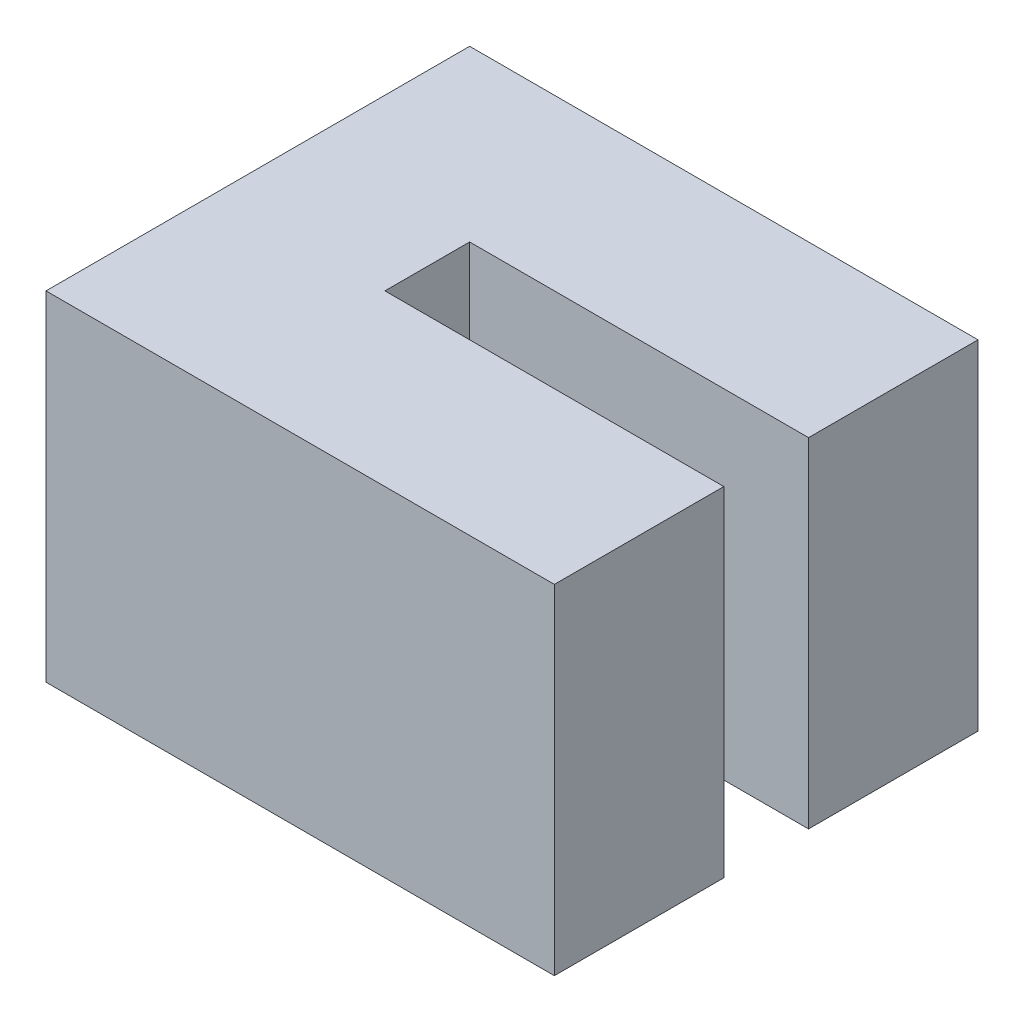
ISO-10303-21;
HEADER;
FILE_DESCRIPTION(('STEP AP214'),'2;1');
FILE_NAME('part.step','',(''),(''),'','','');
FILE_SCHEMA(('AUTOMOTIVE_DESIGN { 1 0 10303 214 1 1 1 1 }'));
ENDSEC;
DATA;
#1=APPLICATION_CONTEXT('core data for automotive mechanical design processes');
#2=APPLICATION_PROTOCOL_DEFINITION('international standard','automotive_design',2000,#1);
#3=PRODUCT_CONTEXT('',#1,'mechanical');
#4=PRODUCT('Part','Part','',(#3));
#5=PRODUCT_RELATED_PRODUCT_CATEGORY('part','',(#4));
#6=PRODUCT_DEFINITION_FORMATION('','',#4);
#7=PRODUCT_DEFINITION_CONTEXT('part definition',#1,'design');
#8=PRODUCT_DEFINITION('design','',#6,#7);
#9=PRODUCT_DEFINITION_SHAPE('','',#8);
#10=(LENGTH_UNIT() NAMED_UNIT(*) SI_UNIT(.MILLI.,.METRE.));
#11=(NAMED_UNIT(*) PLANE_ANGLE_UNIT() SI_UNIT($,.RADIAN.));
#12=(NAMED_UNIT(*) SI_UNIT($,.STERADIAN.) SOLID_ANGLE_UNIT());
#13=UNCERTAINTY_MEASURE_WITH_UNIT(LENGTH_MEASURE(1.E-05),#10,'distance_accuracy_value','');
#14=(GEOMETRIC_REPRESENTATION_CONTEXT(3) GLOBAL_UNCERTAINTY_ASSIGNED_CONTEXT((#13)) GLOBAL_UNIT_ASSIGNED_CONTEXT((#10,
#11,#12)) REPRESENTATION_CONTEXT('',''));
#15=CARTESIAN_POINT('',(0.,0.,0.));
#16=DIRECTION('',(0.,0.,1.));
#17=DIRECTION('',(1.,0.,0.));
#18=AXIS2_PLACEMENT_3D('',#15,#16,#17);
#19=CARTESIAN_POINT('',(30.,20.,0.));
#20=DIRECTION('',(0.,0.,1.));
#21=DIRECTION('',(1.,0.,0.));
#22=AXIS2_PLACEMENT_3D('',#19,#20,#21);
#23=PLANE('',#22);
#24=DIRECTION('',(-1.,0.,0.));
#25=VECTOR('',#24,1.);
#26=CARTESIAN_POINT('',(30.,0.,0.));
#27=LINE('',#26,#25);
#28=CARTESIAN_POINT('',(30.,0.,0.));
#29=VERTEX_POINT('',#28);
#30=CARTESIAN_POINT('',(0.,0.,0.));
#31=VERTEX_POINT('',#30);
#32=EDGE_CURVE('E133',#29,#31,#27,.T.);
#33=ORIENTED_EDGE('',*,*,#32,.T.);
#34=DIRECTION('',(0.,-1.,0.));
#35=VECTOR('',#34,1.);
#36=CARTESIAN_POINT('',(0.,20.,0.));
#37=LINE('',#36,#35);
#38=CARTESIAN_POINT('',(0.,20.,0.));
#39=VERTEX_POINT('',#38);
#40=EDGE_CURVE('E11',#39,#31,#37,.T.);
#41=ORIENTED_EDGE('',*,*,#40,.F.);
#42=DIRECTION('',(-1.,0.,0.));
#43=VECTOR('',#42,1.);
#44=CARTESIAN_POINT('',(30.,20.,0.));
#45=LINE('',#44,#43);
#46=CARTESIAN_POINT('',(30.,20.,0.));
#47=VERTEX_POINT('',#46);
#48=EDGE_CURVE('E147',#47,#39,#45,.T.);
#49=ORIENTED_EDGE('',*,*,#48,.F.);
#50=DIRECTION('',(0.,-1.,0.));
#51=VECTOR('',#50,1.);
#52=CARTESIAN_POINT('',(30.,20.,0.));
#53=LINE('',#52,#51);
#54=EDGE_CURVE('E129',#47,#29,#53,.T.);
#55=ORIENTED_EDGE('',*,*,#54,.T.);
#56=EDGE_LOOP('',(#33,#41,#49,#55));
#57=FACE_BOUND('',#56,.T.);
#58=ADVANCED_FACE('F37',(#57),#23,.F.);
#59=CARTESIAN_POINT('',(0.,20.,0.));
#60=DIRECTION('',(1.,0.,0.));
#61=DIRECTION('',(0.,0.,-1.));
#62=AXIS2_PLACEMENT_3D('',#59,#60,#61);
#63=PLANE('',#62);
#64=DIRECTION('',(0.,0.,1.));
#65=VECTOR('',#64,1.);
#66=CARTESIAN_POINT('',(0.,0.,0.));
#67=LINE('',#66,#65);
#68=CARTESIAN_POINT('',(0.,0.,25.));
#69=VERTEX_POINT('',#68);
#70=EDGE_CURVE('E136',#31,#69,#67,.T.);
#71=ORIENTED_EDGE('',*,*,#70,.T.);
#72=DIRECTION('',(0.,-1.,0.));
#73=VECTOR('',#72,1.);
#74=CARTESIAN_POINT('',(0.,20.,25.));
#75=LINE('',#74,#73);
#76=CARTESIAN_POINT('',(0.,20.,25.));
#77=VERTEX_POINT('',#76);
#78=EDGE_CURVE('E45',#77,#69,#75,.T.);
#79=ORIENTED_EDGE('',*,*,#78,.F.);
#80=DIRECTION('',(0.,0.,1.));
#81=VECTOR('',#80,1.);
#82=CARTESIAN_POINT('',(0.,20.,0.));
#83=LINE('',#82,#81);
#84=EDGE_CURVE('E96',#39,#77,#83,.T.);
#85=ORIENTED_EDGE('',*,*,#84,.F.);
#86=ORIENTED_EDGE('',*,*,#40,.T.);
#87=EDGE_LOOP('',(#71,#79,#85,#86));
#88=FACE_BOUND('',#87,.T.);
#89=ADVANCED_FACE('F182',(#88),#63,.F.);
#90=CARTESIAN_POINT('',(0.,20.,25.));
#91=DIRECTION('',(0.,0.,-1.));
#92=DIRECTION('',(-1.,0.,0.));
#93=AXIS2_PLACEMENT_3D('',#90,#91,#92);
#94=PLANE('',#93);
#95=DIRECTION('',(1.,0.,0.));
#96=VECTOR('',#95,1.);
#97=CARTESIAN_POINT('',(0.,0.,25.));
#98=LINE('',#97,#96);
#99=CARTESIAN_POINT('',(30.,0.,25.));
#100=VERTEX_POINT('',#99);
#101=EDGE_CURVE('E138',#69,#100,#98,.T.);
#102=ORIENTED_EDGE('',*,*,#101,.T.);
#103=DIRECTION('',(0.,-1.,0.));
#104=VECTOR('',#103,1.);
#105=CARTESIAN_POINT('',(30.,20.,25.));
#106=LINE('',#105,#104);
#107=CARTESIAN_POINT('',(30.,20.,25.));
#108=VERTEX_POINT('',#107);
#109=EDGE_CURVE('E154',#108,#100,#106,.T.);
#110=ORIENTED_EDGE('',*,*,#109,.F.);
#111=DIRECTION('',(1.,0.,0.));
#112=VECTOR('',#111,1.);
#113=CARTESIAN_POINT('',(0.,20.,25.));
#114=LINE('',#113,#112);
#115=EDGE_CURVE('E162',#77,#108,#114,.T.);
#116=ORIENTED_EDGE('',*,*,#115,.F.);
#117=ORIENTED_EDGE('',*,*,#78,.T.);
#118=EDGE_LOOP('',(#102,#110,#116,#117));
#119=FACE_BOUND('',#118,.T.);
#120=ADVANCED_FACE('F160',(#119),#94,.F.);
#121=CARTESIAN_POINT('',(30.,20.,25.));
#122=DIRECTION('',(-1.,0.,0.));
#123=DIRECTION('',(0.,0.,1.));
#124=AXIS2_PLACEMENT_3D('',#121,#122,#123);
#125=PLANE('',#124);
#126=DIRECTION('',(0.,0.,-1.));
#127=VECTOR('',#126,1.);
#128=CARTESIAN_POINT('',(30.,0.,25.));
#129=LINE('',#128,#127);
#130=CARTESIAN_POINT('',(30.,0.,15.));
#131=VERTEX_POINT('',#130);
#132=EDGE_CURVE('E140',#100,#131,#129,.T.);
#133=ORIENTED_EDGE('',*,*,#132,.T.);
#134=DIRECTION('',(0.,-1.,0.));
#135=VECTOR('',#134,1.);
#136=CARTESIAN_POINT('',(30.,20.,15.));
#137=LINE('',#136,#135);
#138=CARTESIAN_POINT('',(30.,20.,15.));
#139=VERTEX_POINT('',#138);
#140=EDGE_CURVE('E151',#139,#131,#137,.T.);
#141=ORIENTED_EDGE('',*,*,#140,.F.);
#142=DIRECTION('',(0.,0.,-1.));
#143=VECTOR('',#142,1.);
#144=CARTESIAN_POINT('',(30.,20.,25.));
#145=LINE('',#144,#143);
#146=EDGE_CURVE('E174',#108,#139,#145,.T.);
#147=ORIENTED_EDGE('',*,*,#146,.F.);
#148=ORIENTED_EDGE('',*,*,#109,.T.);
#149=EDGE_LOOP('',(#133,#141,#147,#148));
#150=FACE_BOUND('',#149,.T.);
#151=ADVANCED_FACE('F170',(#150),#125,.F.);
#152=CARTESIAN_POINT('',(30.,20.,15.));
#153=DIRECTION('',(0.,0.,1.));
#154=DIRECTION('',(1.,0.,0.));
#155=AXIS2_PLACEMENT_3D('',#152,#153,#154);
#156=PLANE('',#155);
#157=DIRECTION('',(-1.,0.,0.));
#158=VECTOR('',#157,1.);
#159=CARTESIAN_POINT('',(30.,0.,15.));
#160=LINE('',#159,#158);
#161=CARTESIAN_POINT('',(10.,0.,15.));
#162=VERTEX_POINT('',#161);
#163=EDGE_CURVE('E142',#131,#162,#160,.T.);
#164=ORIENTED_EDGE('',*,*,#163,.T.);
#165=DIRECTION('',(0.,-1.,0.));
#166=VECTOR('',#165,1.);
#167=CARTESIAN_POINT('',(10.,20.,15.));
#168=LINE('',#167,#166);
#169=CARTESIAN_POINT('',(10.,20.,15.));
#170=VERTEX_POINT('',#169);
#171=EDGE_CURVE('E124',#170,#162,#168,.T.);
#172=ORIENTED_EDGE('',*,*,#171,.F.);
#173=DIRECTION('',(-1.,0.,0.));
#174=VECTOR('',#173,1.);
#175=CARTESIAN_POINT('',(30.,20.,15.));
#176=LINE('',#175,#174);
#177=EDGE_CURVE('E115',#139,#170,#176,.T.);
#178=ORIENTED_EDGE('',*,*,#177,.F.);
#179=ORIENTED_EDGE('',*,*,#140,.T.);
#180=EDGE_LOOP('',(#164,#172,#178,#179));
#181=FACE_BOUND('',#180,.T.);
#182=ADVANCED_FACE('F173',(#181),#156,.F.);
#183=CARTESIAN_POINT('',(10.,20.,15.));
#184=DIRECTION('',(-1.,0.,0.));
#185=DIRECTION('',(0.,0.,1.));
#186=AXIS2_PLACEMENT_3D('',#183,#184,#185);
#187=PLANE('',#186);
#188=DIRECTION('',(0.,0.,-1.));
#189=VECTOR('',#188,1.);
#190=CARTESIAN_POINT('',(10.,0.,15.));
#191=LINE('',#190,#189);
#192=CARTESIAN_POINT('',(10.,0.,10.));
#193=VERTEX_POINT('',#192);
#194=EDGE_CURVE('E123',#162,#193,#191,.T.);
#195=ORIENTED_EDGE('',*,*,#194,.T.);
#196=DIRECTION('',(0.,-1.,0.));
#197=VECTOR('',#196,1.);
#198=CARTESIAN_POINT('',(10.,20.,10.));
#199=LINE('',#198,#197);
#200=CARTESIAN_POINT('',(10.,20.,10.));
#201=VERTEX_POINT('',#200);
#202=EDGE_CURVE('E120',#201,#193,#199,.T.);
#203=ORIENTED_EDGE('',*,*,#202,.F.);
#204=DIRECTION('',(0.,0.,-1.));
#205=VECTOR('',#204,1.);
#206=CARTESIAN_POINT('',(10.,20.,15.));
#207=LINE('',#206,#205);
#208=EDGE_CURVE('E109',#170,#201,#207,.T.);
#209=ORIENTED_EDGE('',*,*,#208,.F.);
#210=ORIENTED_EDGE('',*,*,#171,.T.);
#211=EDGE_LOOP('',(#195,#203,#209,#210));
#212=FACE_BOUND('',#211,.T.);
#213=ADVANCED_FACE('F121',(#212),#187,.F.);
#214=CARTESIAN_POINT('',(10.,20.,10.));
#215=DIRECTION('',(0.,0.,-1.));
#216=DIRECTION('',(-1.,0.,0.));
#217=AXIS2_PLACEMENT_3D('',#214,#215,#216);
#218=PLANE('',#217);
#219=DIRECTION('',(1.,0.,0.));
#220=VECTOR('',#219,1.);
#221=CARTESIAN_POINT('',(10.,0.,10.));
#222=LINE('',#221,#220);
#223=CARTESIAN_POINT('',(30.,0.,10.));
#224=VERTEX_POINT('',#223);
#225=EDGE_CURVE('E82',#193,#224,#222,.T.);
#226=ORIENTED_EDGE('',*,*,#225,.T.);
#227=DIRECTION('',(0.,-1.,0.));
#228=VECTOR('',#227,1.);
#229=CARTESIAN_POINT('',(30.,20.,10.));
#230=LINE('',#229,#228);
#231=CARTESIAN_POINT('',(30.,20.,10.));
#232=VERTEX_POINT('',#231);
#233=EDGE_CURVE('E125',#232,#224,#230,.T.);
#234=ORIENTED_EDGE('',*,*,#233,.F.);
#235=DIRECTION('',(1.,0.,0.));
#236=VECTOR('',#235,1.);
#237=CARTESIAN_POINT('',(10.,20.,10.));
#238=LINE('',#237,#236);
#239=EDGE_CURVE('E113',#201,#232,#238,.T.);
#240=ORIENTED_EDGE('',*,*,#239,.F.);
#241=ORIENTED_EDGE('',*,*,#202,.T.);
#242=EDGE_LOOP('',(#226,#234,#240,#241));
#243=FACE_BOUND('',#242,.T.);
#244=ADVANCED_FACE('F127',(#243),#218,.F.);
#245=CARTESIAN_POINT('',(30.,20.,10.));
#246=DIRECTION('',(-1.,0.,0.));
#247=DIRECTION('',(0.,0.,1.));
#248=AXIS2_PLACEMENT_3D('',#245,#246,#247);
#249=PLANE('',#248);
#250=DIRECTION('',(0.,0.,-1.));
#251=VECTOR('',#250,1.);
#252=CARTESIAN_POINT('',(30.,0.,10.));
#253=LINE('',#252,#251);
#254=EDGE_CURVE('E88',#224,#29,#253,.T.);
#255=ORIENTED_EDGE('',*,*,#254,.T.);
#256=ORIENTED_EDGE('',*,*,#54,.F.);
#257=DIRECTION('',(0.,0.,-1.));
#258=VECTOR('',#257,1.);
#259=CARTESIAN_POINT('',(30.,20.,10.));
#260=LINE('',#259,#258);
#261=EDGE_CURVE('E53',#232,#47,#260,.T.);
#262=ORIENTED_EDGE('',*,*,#261,.F.);
#263=ORIENTED_EDGE('',*,*,#233,.T.);
#264=EDGE_LOOP('',(#255,#256,#262,#263));
#265=FACE_BOUND('',#264,.T.);
#266=ADVANCED_FACE('F198',(#265),#249,.F.);
#267=CARTESIAN_POINT('',(0.,20.,0.));
#268=DIRECTION('',(0.,1.,0.));
#269=DIRECTION('',(0.,0.,1.));
#270=AXIS2_PLACEMENT_3D('',#267,#268,#269);
#271=PLANE('',#270);
#272=ORIENTED_EDGE('',*,*,#48,.T.);
#273=ORIENTED_EDGE('',*,*,#84,.T.);
#274=ORIENTED_EDGE('',*,*,#115,.T.);
#275=ORIENTED_EDGE('',*,*,#146,.T.);
#276=ORIENTED_EDGE('',*,*,#177,.T.);
#277=ORIENTED_EDGE('',*,*,#208,.T.);
#278=ORIENTED_EDGE('',*,*,#239,.T.);
#279=ORIENTED_EDGE('',*,*,#261,.T.);
#280=EDGE_LOOP('',(#272,#273,#274,#275,#276,#277,#278,#279));
#281=FACE_BOUND('',#280,.T.);
#282=ADVANCED_FACE('F111',(#281),#271,.T.);
#283=CARTESIAN_POINT('',(0.,0.,0.));
#284=DIRECTION('',(0.,1.,0.));
#285=DIRECTION('',(0.,0.,1.));
#286=AXIS2_PLACEMENT_3D('',#283,#284,#285);
#287=PLANE('',#286);
#288=ORIENTED_EDGE('',*,*,#32,.F.);
#289=ORIENTED_EDGE('',*,*,#254,.F.);
#290=ORIENTED_EDGE('',*,*,#225,.F.);
#291=ORIENTED_EDGE('',*,*,#194,.F.);
#292=ORIENTED_EDGE('',*,*,#163,.F.);
#293=ORIENTED_EDGE('',*,*,#132,.F.);
#294=ORIENTED_EDGE('',*,*,#101,.F.);
#295=ORIENTED_EDGE('',*,*,#70,.F.);
#296=EDGE_LOOP('',(#288,#289,#290,#291,#292,#293,#294,#295));
#297=FACE_BOUND('',#296,.T.);
#298=ADVANCED_FACE('F166',(#297),#287,.F.);
#299=CLOSED_SHELL('',(#58,#89,#120,#151,#182,#213,#244,#266,#282,#298));
#300=MANIFOLD_SOLID_BREP('B2',#299);
#301=ADVANCED_BREP_SHAPE_REPRESENTATION('',(#18,#300),#14);
#302=SHAPE_DEFINITION_REPRESENTATION(#9,#301);
ENDSEC;
END-ISO-10303-21;
